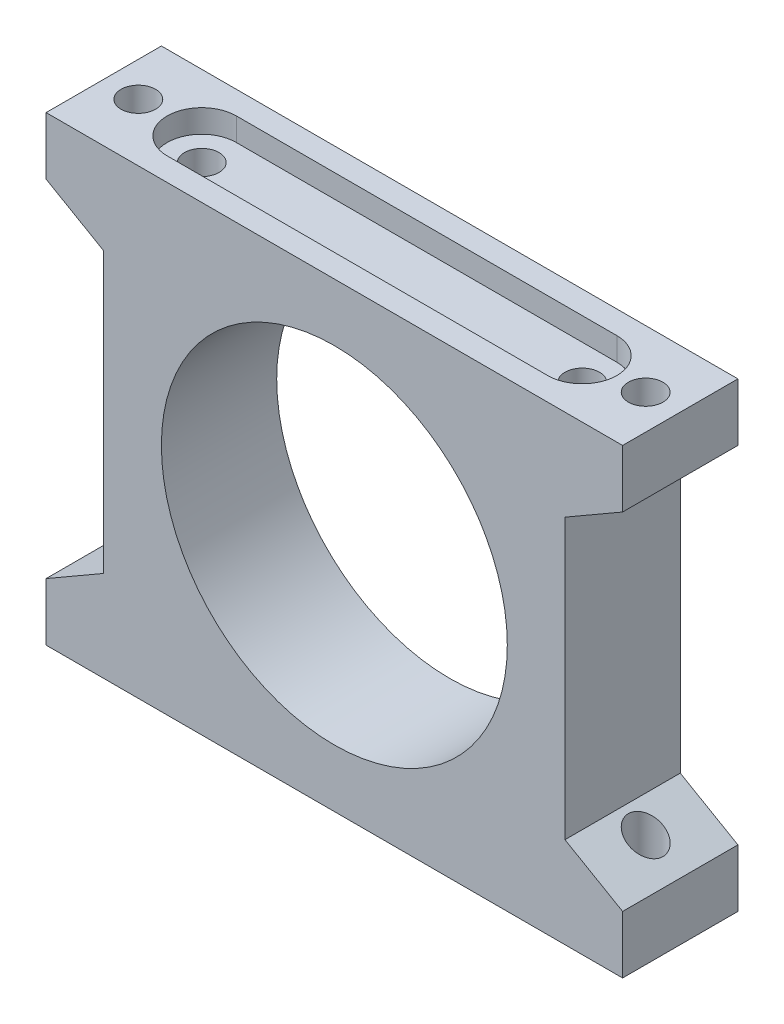
ISO-10303-21;
HEADER;
FILE_DESCRIPTION(('STEP AP214'),'2;1');
FILE_NAME('part.step','',(''),(''),'','','');
FILE_SCHEMA(('AUTOMOTIVE_DESIGN { 1 0 10303 214 1 1 1 1 }'));
ENDSEC;
DATA;
#1=APPLICATION_CONTEXT('core data for automotive mechanical design processes');
#2=APPLICATION_PROTOCOL_DEFINITION('international standard','automotive_design',2000,#1);
#3=PRODUCT_CONTEXT('',#1,'mechanical');
#4=PRODUCT('Part','Part','',(#3));
#5=PRODUCT_RELATED_PRODUCT_CATEGORY('part','',(#4));
#6=PRODUCT_DEFINITION_FORMATION('','',#4);
#7=PRODUCT_DEFINITION_CONTEXT('part definition',#1,'design');
#8=PRODUCT_DEFINITION('design','',#6,#7);
#9=PRODUCT_DEFINITION_SHAPE('','',#8);
#10=(LENGTH_UNIT() NAMED_UNIT(*) SI_UNIT(.MILLI.,.METRE.));
#11=(NAMED_UNIT(*) PLANE_ANGLE_UNIT() SI_UNIT($,.RADIAN.));
#12=(NAMED_UNIT(*) SI_UNIT($,.STERADIAN.) SOLID_ANGLE_UNIT());
#13=UNCERTAINTY_MEASURE_WITH_UNIT(LENGTH_MEASURE(1.E-05),#10,'distance_accuracy_value','');
#14=(GEOMETRIC_REPRESENTATION_CONTEXT(3) GLOBAL_UNCERTAINTY_ASSIGNED_CONTEXT((#13)) GLOBAL_UNIT_ASSIGNED_CONTEXT((#10,
#11,#12)) REPRESENTATION_CONTEXT('',''));
#15=CARTESIAN_POINT('',(0.,0.,0.));
#16=DIRECTION('',(0.,0.,1.));
#17=DIRECTION('',(1.,0.,0.));
#18=AXIS2_PLACEMENT_3D('',#15,#16,#17);
#19=CARTESIAN_POINT('',(-25.,-20.,10.));
#20=DIRECTION('',(0.,1.,0.));
#21=DIRECTION('',(0.,0.,1.));
#22=AXIS2_PLACEMENT_3D('',#19,#20,#21);
#23=PLANE('',#22);
#24=DIRECTION('',(1.,0.,0.));
#25=VECTOR('',#24,1.);
#26=CARTESIAN_POINT('',(-25.,-20.,0.));
#27=LINE('',#26,#25);
#28=CARTESIAN_POINT('',(-25.,-20.,0.));
#29=VERTEX_POINT('',#28);
#30=CARTESIAN_POINT('',(25.,-20.,0.));
#31=VERTEX_POINT('',#30);
#32=EDGE_CURVE('E325',#29,#31,#27,.T.);
#33=ORIENTED_EDGE('',*,*,#32,.T.);
#34=DIRECTION('',(0.,0.,-1.));
#35=VECTOR('',#34,1.);
#36=CARTESIAN_POINT('',(25.,-20.,10.));
#37=LINE('',#36,#35);
#38=CARTESIAN_POINT('',(25.,-20.,10.));
#39=VERTEX_POINT('',#38);
#40=EDGE_CURVE('E355',#39,#31,#37,.T.);
#41=ORIENTED_EDGE('',*,*,#40,.F.);
#42=DIRECTION('',(1.,0.,0.));
#43=VECTOR('',#42,1.);
#44=CARTESIAN_POINT('',(-25.,-20.,10.));
#45=LINE('',#44,#43);
#46=CARTESIAN_POINT('',(-25.,-20.,10.));
#47=VERTEX_POINT('',#46);
#48=EDGE_CURVE('E300',#47,#39,#45,.T.);
#49=ORIENTED_EDGE('',*,*,#48,.F.);
#50=DIRECTION('',(0.,0.,-1.));
#51=VECTOR('',#50,1.);
#52=CARTESIAN_POINT('',(-25.,-20.,10.));
#53=LINE('',#52,#51);
#54=EDGE_CURVE('E358',#47,#29,#53,.T.);
#55=ORIENTED_EDGE('',*,*,#54,.T.);
#56=EDGE_LOOP('',(#33,#41,#49,#55));
#57=FACE_BOUND('',#56,.T.);
#58=CARTESIAN_POINT('',(22.,-20.,4.99999999999999));
#59=DIRECTION('',(0.,1.,0.));
#60=DIRECTION('',(0.,0.,1.));
#61=AXIS2_PLACEMENT_3D('',#58,#59,#60);
#62=CIRCLE('',#61,1.5);
#63=CARTESIAN_POINT('',(22.,-20.,6.5));
#64=VERTEX_POINT('',#63);
#65=EDGE_CURVE('E257',#64,#64,#62,.T.);
#66=ORIENTED_EDGE('',*,*,#65,.T.);
#67=EDGE_LOOP('',(#66));
#68=FACE_BOUND('',#67,.T.);
#69=CARTESIAN_POINT('',(-22.,-20.,5.));
#70=DIRECTION('',(0.,1.,0.));
#71=DIRECTION('',(0.,0.,1.));
#72=AXIS2_PLACEMENT_3D('',#69,#70,#71);
#73=CIRCLE('',#72,1.5);
#74=CARTESIAN_POINT('',(-22.,-20.,6.5));
#75=VERTEX_POINT('',#74);
#76=EDGE_CURVE('E263',#75,#75,#73,.T.);
#77=ORIENTED_EDGE('',*,*,#76,.T.);
#78=EDGE_LOOP('',(#77));
#79=FACE_BOUND('',#78,.T.);
#80=CARTESIAN_POINT('',(-16.5,-20.,5.));
#81=DIRECTION('',(0.,1.,0.));
#82=DIRECTION('',(-1.,0.,0.));
#83=AXIS2_PLACEMENT_3D('',#80,#81,#82);
#84=CIRCLE('',#83,3.);
#85=CARTESIAN_POINT('',(-16.5,-20.,2.));
#86=VERTEX_POINT('',#85);
#87=CARTESIAN_POINT('',(-16.5,-20.,8.));
#88=VERTEX_POINT('',#87);
#89=EDGE_CURVE('E56',#86,#88,#84,.T.);
#90=ORIENTED_EDGE('',*,*,#89,.T.);
#91=DIRECTION('',(1.,0.,0.));
#92=VECTOR('',#91,1.);
#93=CARTESIAN_POINT('',(-16.5,-20.,8.));
#94=LINE('',#93,#92);
#95=CARTESIAN_POINT('',(16.5,-20.,8.));
#96=VERTEX_POINT('',#95);
#97=EDGE_CURVE('E198',#88,#96,#94,.T.);
#98=ORIENTED_EDGE('',*,*,#97,.T.);
#99=CARTESIAN_POINT('',(16.5,-20.,5.));
#100=DIRECTION('',(0.,1.,0.));
#101=DIRECTION('',(-1.,0.,0.));
#102=AXIS2_PLACEMENT_3D('',#99,#100,#101);
#103=CIRCLE('',#102,3.);
#104=CARTESIAN_POINT('',(16.5,-20.,1.99999999999999));
#105=VERTEX_POINT('',#104);
#106=EDGE_CURVE('E201',#96,#105,#103,.T.);
#107=ORIENTED_EDGE('',*,*,#106,.T.);
#108=DIRECTION('',(-1.,0.,0.));
#109=VECTOR('',#108,1.);
#110=CARTESIAN_POINT('',(-16.5,-20.,2.));
#111=LINE('',#110,#109);
#112=EDGE_CURVE('E210',#105,#86,#111,.T.);
#113=ORIENTED_EDGE('',*,*,#112,.T.);
#114=EDGE_LOOP('',(#90,#98,#107,#113));
#115=FACE_BOUND('',#114,.T.);
#116=ADVANCED_FACE('F39',(#57,#68,#79,#115),#23,.F.);
#117=CARTESIAN_POINT('',(0.,0.,10.));
#118=DIRECTION('',(0.,0.,-1.));
#119=DIRECTION('',(-1.,0.,0.));
#120=AXIS2_PLACEMENT_3D('',#117,#118,#119);
#121=PLANE('',#120);
#122=DIRECTION('',(0.,-1.,0.));
#123=VECTOR('',#122,1.);
#124=CARTESIAN_POINT('',(-25.,15.,10.));
#125=LINE('',#124,#123);
#126=CARTESIAN_POINT('',(-25.,20.,10.));
#127=VERTEX_POINT('',#126);
#128=CARTESIAN_POINT('',(-25.,15.,10.));
#129=VERTEX_POINT('',#128);
#130=EDGE_CURVE('E288',#127,#129,#125,.T.);
#131=ORIENTED_EDGE('',*,*,#130,.T.);
#132=DIRECTION('',(0.86602540378444,-0.499999999999998,0.));
#133=VECTOR('',#132,1.);
#134=CARTESIAN_POINT('',(-25.,15.,10.));
#135=LINE('',#134,#133);
#136=CARTESIAN_POINT('',(-20.,12.1132486540519,10.));
#137=VERTEX_POINT('',#136);
#138=EDGE_CURVE('E291',#129,#137,#135,.T.);
#139=ORIENTED_EDGE('',*,*,#138,.T.);
#140=DIRECTION('',(0.,-1.,0.));
#141=VECTOR('',#140,1.);
#142=CARTESIAN_POINT('',(-20.,12.1132486540519,10.));
#143=LINE('',#142,#141);
#144=CARTESIAN_POINT('',(-20.,-12.1132486540519,10.));
#145=VERTEX_POINT('',#144);
#146=EDGE_CURVE('E294',#137,#145,#143,.T.);
#147=ORIENTED_EDGE('',*,*,#146,.T.);
#148=DIRECTION('',(-0.86602540378444,-0.499999999999998,0.));
#149=VECTOR('',#148,1.);
#150=CARTESIAN_POINT('',(-20.,-12.1132486540519,10.));
#151=LINE('',#150,#149);
#152=CARTESIAN_POINT('',(-25.,-15.,10.));
#153=VERTEX_POINT('',#152);
#154=EDGE_CURVE('E296',#145,#153,#151,.T.);
#155=ORIENTED_EDGE('',*,*,#154,.T.);
#156=DIRECTION('',(0.,-1.,0.));
#157=VECTOR('',#156,1.);
#158=CARTESIAN_POINT('',(-25.,-20.,10.));
#159=LINE('',#158,#157);
#160=EDGE_CURVE('E298',#153,#47,#159,.T.);
#161=ORIENTED_EDGE('',*,*,#160,.T.);
#162=ORIENTED_EDGE('',*,*,#48,.T.);
#163=DIRECTION('',(0.,1.,0.));
#164=VECTOR('',#163,1.);
#165=CARTESIAN_POINT('',(25.,-15.,10.));
#166=LINE('',#165,#164);
#167=CARTESIAN_POINT('',(25.,-15.,10.));
#168=VERTEX_POINT('',#167);
#169=EDGE_CURVE('E302',#39,#168,#166,.T.);
#170=ORIENTED_EDGE('',*,*,#169,.T.);
#171=DIRECTION('',(-0.86602540378444,0.499999999999998,0.));
#172=VECTOR('',#171,1.);
#173=CARTESIAN_POINT('',(20.,-12.1132486540519,10.));
#174=LINE('',#173,#172);
#175=CARTESIAN_POINT('',(20.,-12.1132486540519,10.));
#176=VERTEX_POINT('',#175);
#177=EDGE_CURVE('E304',#168,#176,#174,.T.);
#178=ORIENTED_EDGE('',*,*,#177,.T.);
#179=DIRECTION('',(0.,1.,0.));
#180=VECTOR('',#179,1.);
#181=CARTESIAN_POINT('',(20.,12.1132486540519,10.));
#182=LINE('',#181,#180);
#183=CARTESIAN_POINT('',(20.,12.1132486540519,10.));
#184=VERTEX_POINT('',#183);
#185=EDGE_CURVE('E306',#176,#184,#182,.T.);
#186=ORIENTED_EDGE('',*,*,#185,.T.);
#187=DIRECTION('',(0.86602540378444,0.499999999999998,0.));
#188=VECTOR('',#187,1.);
#189=CARTESIAN_POINT('',(25.,15.,10.));
#190=LINE('',#189,#188);
#191=CARTESIAN_POINT('',(25.,15.,10.));
#192=VERTEX_POINT('',#191);
#193=EDGE_CURVE('E308',#184,#192,#190,.T.);
#194=ORIENTED_EDGE('',*,*,#193,.T.);
#195=DIRECTION('',(0.,1.,0.));
#196=VECTOR('',#195,1.);
#197=CARTESIAN_POINT('',(25.,20.,10.));
#198=LINE('',#197,#196);
#199=CARTESIAN_POINT('',(25.,20.,10.));
#200=VERTEX_POINT('',#199);
#201=EDGE_CURVE('E310',#192,#200,#198,.T.);
#202=ORIENTED_EDGE('',*,*,#201,.T.);
#203=DIRECTION('',(-1.,0.,0.));
#204=VECTOR('',#203,1.);
#205=CARTESIAN_POINT('',(-25.,20.,10.));
#206=LINE('',#205,#204);
#207=EDGE_CURVE('E312',#200,#127,#206,.T.);
#208=ORIENTED_EDGE('',*,*,#207,.T.);
#209=EDGE_LOOP('',(#131,#139,#147,#155,#161,#162,#170,#178,#186,#194,#202,#208));
#210=FACE_BOUND('',#209,.T.);
#211=CARTESIAN_POINT('',(0.,0.,10.));
#212=DIRECTION('',(0.,0.,1.));
#213=DIRECTION('',(1.,0.,0.));
#214=AXIS2_PLACEMENT_3D('',#211,#212,#213);
#215=CIRCLE('',#214,15.);
#216=CARTESIAN_POINT('',(15.,0.,10.));
#217=VERTEX_POINT('',#216);
#218=EDGE_CURVE('E282',#217,#217,#215,.T.);
#219=ORIENTED_EDGE('',*,*,#218,.F.);
#220=EDGE_LOOP('',(#219));
#221=FACE_BOUND('',#220,.T.);
#222=ADVANCED_FACE('F409',(#210,#221),#121,.F.);
#223=CARTESIAN_POINT('',(0.,0.,0.));
#224=DIRECTION('',(0.,0.,-1.));
#225=DIRECTION('',(-1.,0.,0.));
#226=AXIS2_PLACEMENT_3D('',#223,#224,#225);
#227=PLANE('',#226);
#228=DIRECTION('',(0.,-1.,0.));
#229=VECTOR('',#228,1.);
#230=CARTESIAN_POINT('',(-25.,15.,0.));
#231=LINE('',#230,#229);
#232=CARTESIAN_POINT('',(-25.,20.,0.));
#233=VERTEX_POINT('',#232);
#234=CARTESIAN_POINT('',(-25.,15.,0.));
#235=VERTEX_POINT('',#234);
#236=EDGE_CURVE('E285',#233,#235,#231,.T.);
#237=ORIENTED_EDGE('',*,*,#236,.F.);
#238=DIRECTION('',(-1.,0.,0.));
#239=VECTOR('',#238,1.);
#240=CARTESIAN_POINT('',(-25.,20.,0.));
#241=LINE('',#240,#239);
#242=CARTESIAN_POINT('',(25.,20.,0.));
#243=VERTEX_POINT('',#242);
#244=EDGE_CURVE('E292',#243,#233,#241,.T.);
#245=ORIENTED_EDGE('',*,*,#244,.F.);
#246=DIRECTION('',(0.,1.,0.));
#247=VECTOR('',#246,1.);
#248=CARTESIAN_POINT('',(25.,20.,0.));
#249=LINE('',#248,#247);
#250=CARTESIAN_POINT('',(25.,15.,0.));
#251=VERTEX_POINT('',#250);
#252=EDGE_CURVE('E335',#251,#243,#249,.T.);
#253=ORIENTED_EDGE('',*,*,#252,.F.);
#254=DIRECTION('',(0.86602540378444,0.499999999999998,0.));
#255=VECTOR('',#254,1.);
#256=CARTESIAN_POINT('',(25.,15.,0.));
#257=LINE('',#256,#255);
#258=CARTESIAN_POINT('',(20.,12.1132486540519,0.));
#259=VERTEX_POINT('',#258);
#260=EDGE_CURVE('E333',#259,#251,#257,.T.);
#261=ORIENTED_EDGE('',*,*,#260,.F.);
#262=DIRECTION('',(0.,1.,0.));
#263=VECTOR('',#262,1.);
#264=CARTESIAN_POINT('',(20.,12.1132486540519,0.));
#265=LINE('',#264,#263);
#266=CARTESIAN_POINT('',(20.,-12.1132486540519,0.));
#267=VERTEX_POINT('',#266);
#268=EDGE_CURVE('E331',#267,#259,#265,.T.);
#269=ORIENTED_EDGE('',*,*,#268,.F.);
#270=DIRECTION('',(-0.86602540378444,0.499999999999998,0.));
#271=VECTOR('',#270,1.);
#272=CARTESIAN_POINT('',(20.,-12.1132486540519,0.));
#273=LINE('',#272,#271);
#274=CARTESIAN_POINT('',(25.,-15.,0.));
#275=VERTEX_POINT('',#274);
#276=EDGE_CURVE('E329',#275,#267,#273,.T.);
#277=ORIENTED_EDGE('',*,*,#276,.F.);
#278=DIRECTION('',(0.,1.,0.));
#279=VECTOR('',#278,1.);
#280=CARTESIAN_POINT('',(25.,-15.,0.));
#281=LINE('',#280,#279);
#282=EDGE_CURVE('E327',#31,#275,#281,.T.);
#283=ORIENTED_EDGE('',*,*,#282,.F.);
#284=ORIENTED_EDGE('',*,*,#32,.F.);
#285=DIRECTION('',(0.,-1.,0.));
#286=VECTOR('',#285,1.);
#287=CARTESIAN_POINT('',(-25.,-20.,0.));
#288=LINE('',#287,#286);
#289=CARTESIAN_POINT('',(-25.,-15.,0.));
#290=VERTEX_POINT('',#289);
#291=EDGE_CURVE('E323',#290,#29,#288,.T.);
#292=ORIENTED_EDGE('',*,*,#291,.F.);
#293=DIRECTION('',(-0.86602540378444,-0.499999999999998,0.));
#294=VECTOR('',#293,1.);
#295=CARTESIAN_POINT('',(-20.,-12.1132486540519,0.));
#296=LINE('',#295,#294);
#297=CARTESIAN_POINT('',(-20.,-12.1132486540519,0.));
#298=VERTEX_POINT('',#297);
#299=EDGE_CURVE('E321',#298,#290,#296,.T.);
#300=ORIENTED_EDGE('',*,*,#299,.F.);
#301=DIRECTION('',(0.,-1.,0.));
#302=VECTOR('',#301,1.);
#303=CARTESIAN_POINT('',(-20.,12.1132486540519,0.));
#304=LINE('',#303,#302);
#305=CARTESIAN_POINT('',(-20.,12.1132486540519,0.));
#306=VERTEX_POINT('',#305);
#307=EDGE_CURVE('E319',#306,#298,#304,.T.);
#308=ORIENTED_EDGE('',*,*,#307,.F.);
#309=DIRECTION('',(0.86602540378444,-0.499999999999998,0.));
#310=VECTOR('',#309,1.);
#311=CARTESIAN_POINT('',(-25.,15.,0.));
#312=LINE('',#311,#310);
#313=EDGE_CURVE('E317',#235,#306,#312,.T.);
#314=ORIENTED_EDGE('',*,*,#313,.F.);
#315=EDGE_LOOP('',(#237,#245,#253,#261,#269,#277,#283,#284,#292,#300,#308,#314));
#316=FACE_BOUND('',#315,.T.);
#317=CARTESIAN_POINT('',(0.,0.,0.));
#318=DIRECTION('',(0.,0.,1.));
#319=DIRECTION('',(1.,0.,0.));
#320=AXIS2_PLACEMENT_3D('',#317,#318,#319);
#321=CIRCLE('',#320,15.);
#322=CARTESIAN_POINT('',(15.,0.,0.));
#323=VERTEX_POINT('',#322);
#324=EDGE_CURVE('E281',#323,#323,#321,.T.);
#325=ORIENTED_EDGE('',*,*,#324,.T.);
#326=EDGE_LOOP('',(#325));
#327=FACE_BOUND('',#326,.T.);
#328=ADVANCED_FACE('F401',(#316,#327),#227,.T.);
#329=CARTESIAN_POINT('',(-25.,15.,10.));
#330=DIRECTION('',(1.,0.,0.));
#331=DIRECTION('',(0.,1.,0.));
#332=AXIS2_PLACEMENT_3D('',#329,#330,#331);
#333=PLANE('',#332);
#334=ORIENTED_EDGE('',*,*,#236,.T.);
#335=DIRECTION('',(0.,0.,-1.));
#336=VECTOR('',#335,1.);
#337=CARTESIAN_POINT('',(-25.,15.,10.));
#338=LINE('',#337,#336);
#339=EDGE_CURVE('E12',#129,#235,#338,.T.);
#340=ORIENTED_EDGE('',*,*,#339,.F.);
#341=ORIENTED_EDGE('',*,*,#130,.F.);
#342=DIRECTION('',(0.,0.,-1.));
#343=VECTOR('',#342,1.);
#344=CARTESIAN_POINT('',(-25.,20.,10.));
#345=LINE('',#344,#343);
#346=EDGE_CURVE('E314',#127,#233,#345,.T.);
#347=ORIENTED_EDGE('',*,*,#346,.T.);
#348=EDGE_LOOP('',(#334,#340,#341,#347));
#349=FACE_BOUND('',#348,.T.);
#350=ADVANCED_FACE('F41',(#349),#333,.F.);
#351=CARTESIAN_POINT('',(-25.,15.,10.));
#352=DIRECTION('',(0.499999999999997,0.86602540378444,0.));
#353=DIRECTION('',(-0.86602540378444,0.499999999999998,0.));
#354=AXIS2_PLACEMENT_3D('',#351,#352,#353);
#355=PLANE('',#354);
#356=CARTESIAN_POINT('',(-22.,13.2679491924311,5.));
#357=DIRECTION('',(0.499999999999997,0.86602540378444,0.));
#358=DIRECTION('',(-0.86602540378444,0.499999999999998,0.));
#359=AXIS2_PLACEMENT_3D('',#356,#357,#358);
#360=ELLIPSE('',#359,1.73205080756888,1.5);
#361=CARTESIAN_POINT('',(-23.5,14.1339745962155,5.));
#362=VERTEX_POINT('',#361);
#363=EDGE_CURVE('E278',#362,#362,#360,.T.);
#364=ORIENTED_EDGE('',*,*,#363,.T.);
#365=EDGE_LOOP('',(#364));
#366=FACE_BOUND('',#365,.T.);
#367=ORIENTED_EDGE('',*,*,#313,.T.);
#368=DIRECTION('',(0.,0.,-1.));
#369=VECTOR('',#368,1.);
#370=CARTESIAN_POINT('',(-20.,12.1132486540519,10.));
#371=LINE('',#370,#369);
#372=EDGE_CURVE('E48',#137,#306,#371,.T.);
#373=ORIENTED_EDGE('',*,*,#372,.F.);
#374=ORIENTED_EDGE('',*,*,#138,.F.);
#375=ORIENTED_EDGE('',*,*,#339,.T.);
#376=EDGE_LOOP('',(#367,#373,#374,#375));
#377=FACE_BOUND('',#376,.T.);
#378=ADVANCED_FACE('F445',(#366,#377),#355,.F.);
#379=CARTESIAN_POINT('',(-20.,12.1132486540519,10.));
#380=DIRECTION('',(1.,0.,0.));
#381=DIRECTION('',(0.,1.,0.));
#382=AXIS2_PLACEMENT_3D('',#379,#380,#381);
#383=PLANE('',#382);
#384=ORIENTED_EDGE('',*,*,#307,.T.);
#385=DIRECTION('',(0.,0.,-1.));
#386=VECTOR('',#385,1.);
#387=CARTESIAN_POINT('',(-20.,-12.1132486540519,10.));
#388=LINE('',#387,#386);
#389=EDGE_CURVE('E364',#145,#298,#388,.T.);
#390=ORIENTED_EDGE('',*,*,#389,.F.);
#391=ORIENTED_EDGE('',*,*,#146,.F.);
#392=ORIENTED_EDGE('',*,*,#372,.T.);
#393=EDGE_LOOP('',(#384,#390,#391,#392));
#394=FACE_BOUND('',#393,.T.);
#395=ADVANCED_FACE('F443',(#394),#383,.F.);
#396=CARTESIAN_POINT('',(-20.,-12.1132486540519,10.));
#397=DIRECTION('',(0.499999999999998,-0.86602540378444,0.));
#398=DIRECTION('',(0.86602540378444,0.499999999999998,0.));
#399=AXIS2_PLACEMENT_3D('',#396,#397,#398);
#400=PLANE('',#399);
#401=CARTESIAN_POINT('',(-22.,-13.2679491924311,5.));
#402=DIRECTION('',(0.499999999999998,-0.86602540378444,0.));
#403=DIRECTION('',(0.86602540378444,0.499999999999998,0.));
#404=AXIS2_PLACEMENT_3D('',#401,#402,#403);
#405=ELLIPSE('',#404,1.73205080756888,1.5);
#406=CARTESIAN_POINT('',(-20.5,-12.4019237886467,5.));
#407=VERTEX_POINT('',#406);
#408=EDGE_CURVE('E275',#407,#407,#405,.T.);
#409=ORIENTED_EDGE('',*,*,#408,.T.);
#410=EDGE_LOOP('',(#409));
#411=FACE_BOUND('',#410,.T.);
#412=ORIENTED_EDGE('',*,*,#299,.T.);
#413=DIRECTION('',(0.,0.,-1.));
#414=VECTOR('',#413,1.);
#415=CARTESIAN_POINT('',(-25.,-15.,10.));
#416=LINE('',#415,#414);
#417=EDGE_CURVE('E361',#153,#290,#416,.T.);
#418=ORIENTED_EDGE('',*,*,#417,.F.);
#419=ORIENTED_EDGE('',*,*,#154,.F.);
#420=ORIENTED_EDGE('',*,*,#389,.T.);
#421=EDGE_LOOP('',(#412,#418,#419,#420));
#422=FACE_BOUND('',#421,.T.);
#423=ADVANCED_FACE('F439',(#411,#422),#400,.F.);
#424=CARTESIAN_POINT('',(-25.,-20.,10.));
#425=DIRECTION('',(1.,0.,0.));
#426=DIRECTION('',(0.,1.,0.));
#427=AXIS2_PLACEMENT_3D('',#424,#425,#426);
#428=PLANE('',#427);
#429=ORIENTED_EDGE('',*,*,#291,.T.);
#430=ORIENTED_EDGE('',*,*,#54,.F.);
#431=ORIENTED_EDGE('',*,*,#160,.F.);
#432=ORIENTED_EDGE('',*,*,#417,.T.);
#433=EDGE_LOOP('',(#429,#430,#431,#432));
#434=FACE_BOUND('',#433,.T.);
#435=ADVANCED_FACE('F434',(#434),#428,.F.);
#436=CARTESIAN_POINT('',(25.,-15.,10.));
#437=DIRECTION('',(-1.,0.,0.));
#438=DIRECTION('',(0.,-1.,0.));
#439=AXIS2_PLACEMENT_3D('',#436,#437,#438);
#440=PLANE('',#439);
#441=ORIENTED_EDGE('',*,*,#282,.T.);
#442=DIRECTION('',(0.,0.,-1.));
#443=VECTOR('',#442,1.);
#444=CARTESIAN_POINT('',(25.,-15.,10.));
#445=LINE('',#444,#443);
#446=EDGE_CURVE('E352',#168,#275,#445,.T.);
#447=ORIENTED_EDGE('',*,*,#446,.F.);
#448=ORIENTED_EDGE('',*,*,#169,.F.);
#449=ORIENTED_EDGE('',*,*,#40,.T.);
#450=EDGE_LOOP('',(#441,#447,#448,#449));
#451=FACE_BOUND('',#450,.T.);
#452=ADVANCED_FACE('F424',(#451),#440,.F.);
#453=CARTESIAN_POINT('',(20.,-12.1132486540519,10.));
#454=DIRECTION('',(-0.499999999999998,-0.86602540378444,0.));
#455=DIRECTION('',(0.86602540378444,-0.499999999999998,0.));
#456=AXIS2_PLACEMENT_3D('',#453,#454,#455);
#457=PLANE('',#456);
#458=CARTESIAN_POINT('',(22.,-13.2679491924311,4.99999999999999));
#459=DIRECTION('',(-0.499999999999998,-0.86602540378444,0.));
#460=DIRECTION('',(-0.86602540378444,0.499999999999998,0.));
#461=AXIS2_PLACEMENT_3D('',#458,#459,#460);
#462=ELLIPSE('',#461,1.73205080756888,1.5);
#463=CARTESIAN_POINT('',(20.5,-12.4019237886467,4.99999999999999));
#464=VERTEX_POINT('',#463);
#465=EDGE_CURVE('E272',#464,#464,#462,.T.);
#466=ORIENTED_EDGE('',*,*,#465,.T.);
#467=EDGE_LOOP('',(#466));
#468=FACE_BOUND('',#467,.T.);
#469=ORIENTED_EDGE('',*,*,#276,.T.);
#470=DIRECTION('',(0.,0.,-1.));
#471=VECTOR('',#470,1.);
#472=CARTESIAN_POINT('',(20.,-12.1132486540519,10.));
#473=LINE('',#472,#471);
#474=EDGE_CURVE('E349',#176,#267,#473,.T.);
#475=ORIENTED_EDGE('',*,*,#474,.F.);
#476=ORIENTED_EDGE('',*,*,#177,.F.);
#477=ORIENTED_EDGE('',*,*,#446,.T.);
#478=EDGE_LOOP('',(#469,#475,#476,#477));
#479=FACE_BOUND('',#478,.T.);
#480=ADVANCED_FACE('F420',(#468,#479),#457,.F.);
#481=CARTESIAN_POINT('',(20.,12.1132486540519,10.));
#482=DIRECTION('',(-1.,0.,0.));
#483=DIRECTION('',(0.,-1.,0.));
#484=AXIS2_PLACEMENT_3D('',#481,#482,#483);
#485=PLANE('',#484);
#486=ORIENTED_EDGE('',*,*,#268,.T.);
#487=DIRECTION('',(0.,0.,-1.));
#488=VECTOR('',#487,1.);
#489=CARTESIAN_POINT('',(20.,12.1132486540519,10.));
#490=LINE('',#489,#488);
#491=EDGE_CURVE('E346',#184,#259,#490,.T.);
#492=ORIENTED_EDGE('',*,*,#491,.F.);
#493=ORIENTED_EDGE('',*,*,#185,.F.);
#494=ORIENTED_EDGE('',*,*,#474,.T.);
#495=EDGE_LOOP('',(#486,#492,#493,#494));
#496=FACE_BOUND('',#495,.T.);
#497=ADVANCED_FACE('F387',(#496),#485,.F.);
#498=CARTESIAN_POINT('',(25.,15.,10.));
#499=DIRECTION('',(-0.499999999999997,0.86602540378444,0.));
#500=DIRECTION('',(-0.86602540378444,-0.499999999999998,0.));
#501=AXIS2_PLACEMENT_3D('',#498,#499,#500);
#502=PLANE('',#501);
#503=CARTESIAN_POINT('',(22.,13.2679491924311,4.99999999999999));
#504=DIRECTION('',(-0.499999999999997,0.86602540378444,0.));
#505=DIRECTION('',(0.86602540378444,0.499999999999998,0.));
#506=AXIS2_PLACEMENT_3D('',#503,#504,#505);
#507=ELLIPSE('',#506,1.73205080756888,1.5);
#508=CARTESIAN_POINT('',(23.5,14.1339745962155,4.99999999999999));
#509=VERTEX_POINT('',#508);
#510=EDGE_CURVE('E269',#509,#509,#507,.T.);
#511=ORIENTED_EDGE('',*,*,#510,.T.);
#512=EDGE_LOOP('',(#511));
#513=FACE_BOUND('',#512,.T.);
#514=ORIENTED_EDGE('',*,*,#260,.T.);
#515=DIRECTION('',(0.,0.,-1.));
#516=VECTOR('',#515,1.);
#517=CARTESIAN_POINT('',(25.,15.,10.));
#518=LINE('',#517,#516);
#519=EDGE_CURVE('E343',#192,#251,#518,.T.);
#520=ORIENTED_EDGE('',*,*,#519,.F.);
#521=ORIENTED_EDGE('',*,*,#193,.F.);
#522=ORIENTED_EDGE('',*,*,#491,.T.);
#523=EDGE_LOOP('',(#514,#520,#521,#522));
#524=FACE_BOUND('',#523,.T.);
#525=ADVANCED_FACE('F383',(#513,#524),#502,.F.);
#526=CARTESIAN_POINT('',(25.,20.,10.));
#527=DIRECTION('',(-1.,0.,0.));
#528=DIRECTION('',(0.,-1.,0.));
#529=AXIS2_PLACEMENT_3D('',#526,#527,#528);
#530=PLANE('',#529);
#531=ORIENTED_EDGE('',*,*,#252,.T.);
#532=DIRECTION('',(0.,0.,-1.));
#533=VECTOR('',#532,1.);
#534=CARTESIAN_POINT('',(25.,20.,10.));
#535=LINE('',#534,#533);
#536=EDGE_CURVE('E340',#200,#243,#535,.T.);
#537=ORIENTED_EDGE('',*,*,#536,.F.);
#538=ORIENTED_EDGE('',*,*,#201,.F.);
#539=ORIENTED_EDGE('',*,*,#519,.T.);
#540=EDGE_LOOP('',(#531,#537,#538,#539));
#541=FACE_BOUND('',#540,.T.);
#542=ADVANCED_FACE('F386',(#541),#530,.F.);
#543=CARTESIAN_POINT('',(-25.,20.,10.));
#544=DIRECTION('',(0.,-1.,0.));
#545=DIRECTION('',(1.,0.,0.));
#546=AXIS2_PLACEMENT_3D('',#543,#544,#545);
#547=PLANE('',#546);
#548=DIRECTION('',(1.,0.,0.));
#549=VECTOR('',#548,1.);
#550=CARTESIAN_POINT('',(-16.5,20.,8.));
#551=LINE('',#550,#549);
#552=CARTESIAN_POINT('',(-16.5,20.,8.));
#553=VERTEX_POINT('',#552);
#554=CARTESIAN_POINT('',(16.5,20.,8.));
#555=VERTEX_POINT('',#554);
#556=EDGE_CURVE('E247',#553,#555,#551,.T.);
#557=ORIENTED_EDGE('',*,*,#556,.F.);
#558=CARTESIAN_POINT('',(-16.5,20.,5.));
#559=DIRECTION('',(0.,1.,0.));
#560=DIRECTION('',(-1.,0.,0.));
#561=AXIS2_PLACEMENT_3D('',#558,#559,#560);
#562=CIRCLE('',#561,3.);
#563=CARTESIAN_POINT('',(-16.5,20.,2.));
#564=VERTEX_POINT('',#563);
#565=EDGE_CURVE('E64',#564,#553,#562,.T.);
#566=ORIENTED_EDGE('',*,*,#565,.F.);
#567=DIRECTION('',(-1.,0.,0.));
#568=VECTOR('',#567,1.);
#569=CARTESIAN_POINT('',(-16.5,20.,2.));
#570=LINE('',#569,#568);
#571=CARTESIAN_POINT('',(16.5,20.,1.99999999999999));
#572=VERTEX_POINT('',#571);
#573=EDGE_CURVE('E236',#572,#564,#570,.T.);
#574=ORIENTED_EDGE('',*,*,#573,.F.);
#575=CARTESIAN_POINT('',(16.5,20.,5.));
#576=DIRECTION('',(0.,1.,0.));
#577=DIRECTION('',(-1.,0.,0.));
#578=AXIS2_PLACEMENT_3D('',#575,#576,#577);
#579=CIRCLE('',#578,3.);
#580=EDGE_CURVE('E250',#555,#572,#579,.T.);
#581=ORIENTED_EDGE('',*,*,#580,.F.);
#582=EDGE_LOOP('',(#557,#566,#574,#581));
#583=FACE_BOUND('',#582,.T.);
#584=CARTESIAN_POINT('',(-22.,20.,5.));
#585=DIRECTION('',(0.,-1.,0.));
#586=DIRECTION('',(1.,0.,0.));
#587=AXIS2_PLACEMENT_3D('',#584,#585,#586);
#588=CIRCLE('',#587,1.5);
#589=CARTESIAN_POINT('',(-20.5,20.,5.));
#590=VERTEX_POINT('',#589);
#591=EDGE_CURVE('E43',#590,#590,#588,.T.);
#592=ORIENTED_EDGE('',*,*,#591,.T.);
#593=EDGE_LOOP('',(#592));
#594=FACE_BOUND('',#593,.T.);
#595=CARTESIAN_POINT('',(22.,20.,4.99999999999999));
#596=DIRECTION('',(0.,-1.,0.));
#597=DIRECTION('',(1.,0.,0.));
#598=AXIS2_PLACEMENT_3D('',#595,#596,#597);
#599=CIRCLE('',#598,1.5);
#600=CARTESIAN_POINT('',(23.5,20.,4.99999999999999));
#601=VERTEX_POINT('',#600);
#602=EDGE_CURVE('E266',#601,#601,#599,.T.);
#603=ORIENTED_EDGE('',*,*,#602,.T.);
#604=EDGE_LOOP('',(#603));
#605=FACE_BOUND('',#604,.T.);
#606=ORIENTED_EDGE('',*,*,#244,.T.);
#607=ORIENTED_EDGE('',*,*,#346,.F.);
#608=ORIENTED_EDGE('',*,*,#207,.F.);
#609=ORIENTED_EDGE('',*,*,#536,.T.);
#610=EDGE_LOOP('',(#606,#607,#608,#609));
#611=FACE_BOUND('',#610,.T.);
#612=ADVANCED_FACE('F371',(#583,#594,#605,#611),#547,.F.);
#613=CARTESIAN_POINT('',(0.,0.,10.));
#614=DIRECTION('',(0.,0.,-1.));
#615=DIRECTION('',(-1.,0.,0.));
#616=AXIS2_PLACEMENT_3D('',#613,#614,#615);
#617=CYLINDRICAL_SURFACE('',#616,15.);
#618=ORIENTED_EDGE('',*,*,#218,.T.);
#619=EDGE_LOOP('',(#618));
#620=FACE_BOUND('',#619,.T.);
#621=ORIENTED_EDGE('',*,*,#324,.F.);
#622=EDGE_LOOP('',(#621));
#623=FACE_BOUND('',#622,.T.);
#624=ADVANCED_FACE('F378',(#620,#623),#617,.F.);
#625=CARTESIAN_POINT('',(22.,-20.,4.99999999999999));
#626=DIRECTION('',(0.,1.,0.));
#627=DIRECTION('',(0.,0.,1.));
#628=AXIS2_PLACEMENT_3D('',#625,#626,#627);
#629=CYLINDRICAL_SURFACE('',#628,1.5);
#630=ORIENTED_EDGE('',*,*,#602,.F.);
#631=EDGE_LOOP('',(#630));
#632=FACE_BOUND('',#631,.T.);
#633=ORIENTED_EDGE('',*,*,#510,.F.);
#634=EDGE_LOOP('',(#633));
#635=FACE_BOUND('',#634,.T.);
#636=ADVANCED_FACE('F374',(#632,#635),#629,.F.);
#637=CARTESIAN_POINT('',(-22.,-20.,5.));
#638=DIRECTION('',(0.,1.,0.));
#639=DIRECTION('',(0.,0.,1.));
#640=AXIS2_PLACEMENT_3D('',#637,#638,#639);
#641=CYLINDRICAL_SURFACE('',#640,1.5);
#642=ORIENTED_EDGE('',*,*,#591,.F.);
#643=EDGE_LOOP('',(#642));
#644=FACE_BOUND('',#643,.T.);
#645=ORIENTED_EDGE('',*,*,#363,.F.);
#646=EDGE_LOOP('',(#645));
#647=FACE_BOUND('',#646,.T.);
#648=ADVANCED_FACE('F377',(#644,#647),#641,.F.);
#649=ORIENTED_EDGE('',*,*,#65,.F.);
#650=EDGE_LOOP('',(#649));
#651=FACE_BOUND('',#650,.T.);
#652=ORIENTED_EDGE('',*,*,#465,.F.);
#653=EDGE_LOOP('',(#652));
#654=FACE_BOUND('',#653,.T.);
#655=ADVANCED_FACE('F380',(#651,#654),#629,.F.);
#656=ORIENTED_EDGE('',*,*,#76,.F.);
#657=EDGE_LOOP('',(#656));
#658=FACE_BOUND('',#657,.T.);
#659=ORIENTED_EDGE('',*,*,#408,.F.);
#660=EDGE_LOOP('',(#659));
#661=FACE_BOUND('',#660,.T.);
#662=ADVANCED_FACE('F472',(#658,#661),#641,.F.);
#663=CARTESIAN_POINT('',(-16.5,18.,5.));
#664=DIRECTION('',(0.,1.,0.));
#665=DIRECTION('',(-1.,0.,0.));
#666=AXIS2_PLACEMENT_3D('',#663,#664,#665);
#667=CYLINDRICAL_SURFACE('',#666,3.);
#668=ORIENTED_EDGE('',*,*,#565,.T.);
#669=DIRECTION('',(0.,1.,0.));
#670=VECTOR('',#669,1.);
#671=CARTESIAN_POINT('',(-16.5,18.,8.));
#672=LINE('',#671,#670);
#673=CARTESIAN_POINT('',(-16.5,18.,8.));
#674=VERTEX_POINT('',#673);
#675=EDGE_CURVE('E245',#674,#553,#672,.T.);
#676=ORIENTED_EDGE('',*,*,#675,.F.);
#677=CARTESIAN_POINT('',(-16.5,18.,5.));
#678=DIRECTION('',(0.,1.,0.));
#679=DIRECTION('',(-1.,0.,0.));
#680=AXIS2_PLACEMENT_3D('',#677,#678,#679);
#681=CIRCLE('',#680,3.);
#682=CARTESIAN_POINT('',(-16.5,18.,2.));
#683=VERTEX_POINT('',#682);
#684=EDGE_CURVE('E232',#683,#674,#681,.T.);
#685=ORIENTED_EDGE('',*,*,#684,.F.);
#686=DIRECTION('',(0.,1.,0.));
#687=VECTOR('',#686,1.);
#688=CARTESIAN_POINT('',(-16.5,18.,2.));
#689=LINE('',#688,#687);
#690=EDGE_CURVE('E255',#683,#564,#689,.T.);
#691=ORIENTED_EDGE('',*,*,#690,.T.);
#692=EDGE_LOOP('',(#668,#676,#685,#691));
#693=FACE_BOUND('',#692,.T.);
#694=ADVANCED_FACE('F474',(#693),#667,.F.);
#695=CARTESIAN_POINT('',(-16.5,18.,2.));
#696=DIRECTION('',(0.,0.,-1.));
#697=DIRECTION('',(-1.,0.,0.));
#698=AXIS2_PLACEMENT_3D('',#695,#696,#697);
#699=PLANE('',#698);
#700=ORIENTED_EDGE('',*,*,#573,.T.);
#701=ORIENTED_EDGE('',*,*,#690,.F.);
#702=DIRECTION('',(-1.,0.,0.));
#703=VECTOR('',#702,1.);
#704=CARTESIAN_POINT('',(-16.5,18.,2.));
#705=LINE('',#704,#703);
#706=CARTESIAN_POINT('',(16.5,18.,1.99999999999999));
#707=VERTEX_POINT('',#706);
#708=EDGE_CURVE('E242',#707,#683,#705,.T.);
#709=ORIENTED_EDGE('',*,*,#708,.F.);
#710=DIRECTION('',(0.,1.,0.));
#711=VECTOR('',#710,1.);
#712=CARTESIAN_POINT('',(16.5,18.,1.99999999999999));
#713=LINE('',#712,#711);
#714=EDGE_CURVE('E258',#707,#572,#713,.T.);
#715=ORIENTED_EDGE('',*,*,#714,.T.);
#716=EDGE_LOOP('',(#700,#701,#709,#715));
#717=FACE_BOUND('',#716,.T.);
#718=ADVANCED_FACE('F481',(#717),#699,.F.);
#719=CARTESIAN_POINT('',(16.5,18.,5.));
#720=DIRECTION('',(0.,1.,0.));
#721=DIRECTION('',(-1.,0.,0.));
#722=AXIS2_PLACEMENT_3D('',#719,#720,#721);
#723=CYLINDRICAL_SURFACE('',#722,3.);
#724=ORIENTED_EDGE('',*,*,#580,.T.);
#725=ORIENTED_EDGE('',*,*,#714,.F.);
#726=CARTESIAN_POINT('',(16.5,18.,5.));
#727=DIRECTION('',(0.,1.,0.));
#728=DIRECTION('',(-1.,0.,0.));
#729=AXIS2_PLACEMENT_3D('',#726,#727,#728);
#730=CIRCLE('',#729,3.);
#731=CARTESIAN_POINT('',(16.5,18.,8.));
#732=VERTEX_POINT('',#731);
#733=EDGE_CURVE('E239',#732,#707,#730,.T.);
#734=ORIENTED_EDGE('',*,*,#733,.F.);
#735=DIRECTION('',(0.,1.,0.));
#736=VECTOR('',#735,1.);
#737=CARTESIAN_POINT('',(16.5,18.,8.));
#738=LINE('',#737,#736);
#739=EDGE_CURVE('E260',#732,#555,#738,.T.);
#740=ORIENTED_EDGE('',*,*,#739,.T.);
#741=EDGE_LOOP('',(#724,#725,#734,#740));
#742=FACE_BOUND('',#741,.T.);
#743=ADVANCED_FACE('F615',(#742),#723,.F.);
#744=CARTESIAN_POINT('',(-16.5,18.,8.));
#745=DIRECTION('',(0.,0.,1.));
#746=DIRECTION('',(1.,0.,0.));
#747=AXIS2_PLACEMENT_3D('',#744,#745,#746);
#748=PLANE('',#747);
#749=ORIENTED_EDGE('',*,*,#556,.T.);
#750=ORIENTED_EDGE('',*,*,#739,.F.);
#751=DIRECTION('',(1.,0.,0.));
#752=VECTOR('',#751,1.);
#753=CARTESIAN_POINT('',(-16.5,18.,8.));
#754=LINE('',#753,#752);
#755=EDGE_CURVE('E235',#674,#732,#754,.T.);
#756=ORIENTED_EDGE('',*,*,#755,.F.);
#757=ORIENTED_EDGE('',*,*,#675,.T.);
#758=EDGE_LOOP('',(#749,#750,#756,#757));
#759=FACE_BOUND('',#758,.T.);
#760=ADVANCED_FACE('F626',(#759),#748,.F.);
#761=CARTESIAN_POINT('',(-16.5,18.,5.));
#762=DIRECTION('',(0.,1.,0.));
#763=DIRECTION('',(-1.,0.,0.));
#764=AXIS2_PLACEMENT_3D('',#761,#762,#763);
#765=PLANE('',#764);
#766=CARTESIAN_POINT('',(-16.5,18.,5.));
#767=DIRECTION('',(0.,1.,0.));
#768=DIRECTION('',(-1.,0.,0.));
#769=AXIS2_PLACEMENT_3D('',#766,#767,#768);
#770=CIRCLE('',#769,1.5);
#771=CARTESIAN_POINT('',(-18.,18.,5.));
#772=VERTEX_POINT('',#771);
#773=EDGE_CURVE('E224',#772,#772,#770,.T.);
#774=ORIENTED_EDGE('',*,*,#773,.F.);
#775=EDGE_LOOP('',(#774));
#776=FACE_BOUND('',#775,.T.);
#777=CARTESIAN_POINT('',(16.5,18.,5.00000000000001));
#778=DIRECTION('',(0.,1.,0.));
#779=DIRECTION('',(1.,0.,0.));
#780=AXIS2_PLACEMENT_3D('',#777,#778,#779);
#781=CIRCLE('',#780,1.5);
#782=CARTESIAN_POINT('',(18.,18.,5.00000000000001));
#783=VERTEX_POINT('',#782);
#784=EDGE_CURVE('E227',#783,#783,#781,.T.);
#785=ORIENTED_EDGE('',*,*,#784,.F.);
#786=EDGE_LOOP('',(#785));
#787=FACE_BOUND('',#786,.T.);
#788=ORIENTED_EDGE('',*,*,#684,.T.);
#789=ORIENTED_EDGE('',*,*,#755,.T.);
#790=ORIENTED_EDGE('',*,*,#733,.T.);
#791=ORIENTED_EDGE('',*,*,#708,.T.);
#792=EDGE_LOOP('',(#788,#789,#790,#791));
#793=FACE_BOUND('',#792,.T.);
#794=ADVANCED_FACE('F637',(#776,#787,#793),#765,.T.);
#795=CARTESIAN_POINT('',(16.5,15.,5.00000000000001));
#796=DIRECTION('',(0.,1.,0.));
#797=DIRECTION('',(-1.,0.,0.));
#798=AXIS2_PLACEMENT_3D('',#795,#796,#797);
#799=CYLINDRICAL_SURFACE('',#798,1.5);
#800=CARTESIAN_POINT('',(16.5,15.,5.00000000000001));
#801=DIRECTION('',(0.,1.,0.));
#802=DIRECTION('',(1.,0.,0.));
#803=AXIS2_PLACEMENT_3D('',#800,#801,#802);
#804=CIRCLE('',#803,1.5);
#805=CARTESIAN_POINT('',(18.,15.,5.00000000000001));
#806=VERTEX_POINT('',#805);
#807=EDGE_CURVE('E217',#806,#806,#804,.T.);
#808=ORIENTED_EDGE('',*,*,#807,.F.);
#809=EDGE_LOOP('',(#808));
#810=FACE_BOUND('',#809,.T.);
#811=ORIENTED_EDGE('',*,*,#784,.T.);
#812=EDGE_LOOP('',(#811));
#813=FACE_BOUND('',#812,.T.);
#814=ADVANCED_FACE('F648',(#810,#813),#799,.F.);
#815=CARTESIAN_POINT('',(16.5,15.,5.00000000000001));
#816=DIRECTION('',(0.,-1.,0.));
#817=DIRECTION('',(1.,0.,0.));
#818=AXIS2_PLACEMENT_3D('',#815,#816,#817);
#819=PLANE('',#818);
#820=ORIENTED_EDGE('',*,*,#807,.T.);
#821=EDGE_LOOP('',(#820));
#822=FACE_BOUND('',#821,.T.);
#823=ADVANCED_FACE('F659',(#822),#819,.F.);
#824=CARTESIAN_POINT('',(-16.5,15.,5.));
#825=DIRECTION('',(0.,1.,0.));
#826=DIRECTION('',(-1.,0.,0.));
#827=AXIS2_PLACEMENT_3D('',#824,#825,#826);
#828=CYLINDRICAL_SURFACE('',#827,1.5);
#829=CARTESIAN_POINT('',(-16.5,15.,5.));
#830=DIRECTION('',(0.,1.,0.));
#831=DIRECTION('',(-1.,0.,0.));
#832=AXIS2_PLACEMENT_3D('',#829,#830,#831);
#833=CIRCLE('',#832,1.5);
#834=CARTESIAN_POINT('',(-18.,15.,5.));
#835=VERTEX_POINT('',#834);
#836=EDGE_CURVE('E221',#835,#835,#833,.T.);
#837=ORIENTED_EDGE('',*,*,#836,.F.);
#838=EDGE_LOOP('',(#837));
#839=FACE_BOUND('',#838,.T.);
#840=ORIENTED_EDGE('',*,*,#773,.T.);
#841=EDGE_LOOP('',(#840));
#842=FACE_BOUND('',#841,.T.);
#843=ADVANCED_FACE('F670',(#839,#842),#828,.F.);
#844=CARTESIAN_POINT('',(-16.5,15.,5.));
#845=DIRECTION('',(0.,1.,0.));
#846=DIRECTION('',(-1.,0.,0.));
#847=AXIS2_PLACEMENT_3D('',#844,#845,#846);
#848=PLANE('',#847);
#849=ORIENTED_EDGE('',*,*,#836,.T.);
#850=EDGE_LOOP('',(#849));
#851=FACE_BOUND('',#850,.T.);
#852=ADVANCED_FACE('F681',(#851),#848,.T.);
#853=CARTESIAN_POINT('',(-16.5,-18.,5.));
#854=DIRECTION('',(0.,-1.,0.));
#855=DIRECTION('',(1.,0.,0.));
#856=AXIS2_PLACEMENT_3D('',#853,#854,#855);
#857=CYLINDRICAL_SURFACE('',#856,3.);
#858=ORIENTED_EDGE('',*,*,#89,.F.);
#859=DIRECTION('',(0.,-1.,0.));
#860=VECTOR('',#859,1.);
#861=CARTESIAN_POINT('',(-16.5,-18.,2.));
#862=LINE('',#861,#860);
#863=CARTESIAN_POINT('',(-16.5,-18.,2.));
#864=VERTEX_POINT('',#863);
#865=EDGE_CURVE('E183',#864,#86,#862,.T.);
#866=ORIENTED_EDGE('',*,*,#865,.F.);
#867=CARTESIAN_POINT('',(-16.5,-18.,5.));
#868=DIRECTION('',(0.,1.,0.));
#869=DIRECTION('',(-1.,0.,0.));
#870=AXIS2_PLACEMENT_3D('',#867,#868,#869);
#871=CIRCLE('',#870,3.);
#872=CARTESIAN_POINT('',(-16.5,-18.,8.));
#873=VERTEX_POINT('',#872);
#874=EDGE_CURVE('E190',#864,#873,#871,.T.);
#875=ORIENTED_EDGE('',*,*,#874,.T.);
#876=DIRECTION('',(0.,-1.,0.));
#877=VECTOR('',#876,1.);
#878=CARTESIAN_POINT('',(-16.5,-18.,8.));
#879=LINE('',#878,#877);
#880=EDGE_CURVE('E215',#873,#88,#879,.T.);
#881=ORIENTED_EDGE('',*,*,#880,.T.);
#882=EDGE_LOOP('',(#858,#866,#875,#881));
#883=FACE_BOUND('',#882,.T.);
#884=ADVANCED_FACE('F193',(#883),#857,.F.);
#885=CARTESIAN_POINT('',(-16.5,-18.,8.));
#886=DIRECTION('',(0.,0.,-1.));
#887=DIRECTION('',(-1.,0.,0.));
#888=AXIS2_PLACEMENT_3D('',#885,#886,#887);
#889=PLANE('',#888);
#890=ORIENTED_EDGE('',*,*,#97,.F.);
#891=ORIENTED_EDGE('',*,*,#880,.F.);
#892=DIRECTION('',(1.,0.,0.));
#893=VECTOR('',#892,1.);
#894=CARTESIAN_POINT('',(-16.5,-18.,8.));
#895=LINE('',#894,#893);
#896=CARTESIAN_POINT('',(16.5,-18.,8.));
#897=VERTEX_POINT('',#896);
#898=EDGE_CURVE('E195',#873,#897,#895,.T.);
#899=ORIENTED_EDGE('',*,*,#898,.T.);
#900=DIRECTION('',(0.,-1.,0.));
#901=VECTOR('',#900,1.);
#902=CARTESIAN_POINT('',(16.5,-18.,8.));
#903=LINE('',#902,#901);
#904=EDGE_CURVE('E218',#897,#96,#903,.T.);
#905=ORIENTED_EDGE('',*,*,#904,.T.);
#906=EDGE_LOOP('',(#890,#891,#899,#905));
#907=FACE_BOUND('',#906,.T.);
#908=ADVANCED_FACE('F704',(#907),#889,.T.);
#909=CARTESIAN_POINT('',(16.5,-18.,5.));
#910=DIRECTION('',(0.,-1.,0.));
#911=DIRECTION('',(1.,0.,0.));
#912=AXIS2_PLACEMENT_3D('',#909,#910,#911);
#913=CYLINDRICAL_SURFACE('',#912,3.);
#914=ORIENTED_EDGE('',*,*,#106,.F.);
#915=ORIENTED_EDGE('',*,*,#904,.F.);
#916=CARTESIAN_POINT('',(16.5,-18.,5.));
#917=DIRECTION('',(0.,1.,0.));
#918=DIRECTION('',(-1.,0.,0.));
#919=AXIS2_PLACEMENT_3D('',#916,#917,#918);
#920=CIRCLE('',#919,3.);
#921=CARTESIAN_POINT('',(16.5,-18.,1.99999999999999));
#922=VERTEX_POINT('',#921);
#923=EDGE_CURVE('E189',#897,#922,#920,.T.);
#924=ORIENTED_EDGE('',*,*,#923,.T.);
#925=DIRECTION('',(0.,-1.,0.));
#926=VECTOR('',#925,1.);
#927=CARTESIAN_POINT('',(16.5,-18.,1.99999999999999));
#928=LINE('',#927,#926);
#929=EDGE_CURVE('E185',#922,#105,#928,.T.);
#930=ORIENTED_EDGE('',*,*,#929,.T.);
#931=EDGE_LOOP('',(#914,#915,#924,#930));
#932=FACE_BOUND('',#931,.T.);
#933=ADVANCED_FACE('F714',(#932),#913,.F.);
#934=CARTESIAN_POINT('',(-16.5,-18.,2.));
#935=DIRECTION('',(0.,0.,1.));
#936=DIRECTION('',(1.,0.,0.));
#937=AXIS2_PLACEMENT_3D('',#934,#935,#936);
#938=PLANE('',#937);
#939=ORIENTED_EDGE('',*,*,#112,.F.);
#940=ORIENTED_EDGE('',*,*,#929,.F.);
#941=DIRECTION('',(-1.,0.,0.));
#942=VECTOR('',#941,1.);
#943=CARTESIAN_POINT('',(-16.5,-18.,2.));
#944=LINE('',#943,#942);
#945=EDGE_CURVE('E180',#922,#864,#944,.T.);
#946=ORIENTED_EDGE('',*,*,#945,.T.);
#947=ORIENTED_EDGE('',*,*,#865,.T.);
#948=EDGE_LOOP('',(#939,#940,#946,#947));
#949=FACE_BOUND('',#948,.T.);
#950=ADVANCED_FACE('F182',(#949),#938,.T.);
#951=CARTESIAN_POINT('',(-16.5,-18.,5.));
#952=DIRECTION('',(0.,-1.,0.));
#953=DIRECTION('',(-1.,0.,0.));
#954=AXIS2_PLACEMENT_3D('',#951,#952,#953);
#955=PLANE('',#954);
#956=CARTESIAN_POINT('',(-16.5,-18.,5.));
#957=DIRECTION('',(0.,1.,0.));
#958=DIRECTION('',(-1.,0.,0.));
#959=AXIS2_PLACEMENT_3D('',#956,#957,#958);
#960=CIRCLE('',#959,1.5);
#961=CARTESIAN_POINT('',(-18.,-18.,5.));
#962=VERTEX_POINT('',#961);
#963=EDGE_CURVE('E802',#962,#962,#960,.T.);
#964=ORIENTED_EDGE('',*,*,#963,.T.);
#965=EDGE_LOOP('',(#964));
#966=FACE_BOUND('',#965,.T.);
#967=CARTESIAN_POINT('',(16.5,-18.,5.00000000000001));
#968=DIRECTION('',(0.,1.,0.));
#969=DIRECTION('',(1.,0.,0.));
#970=AXIS2_PLACEMENT_3D('',#967,#968,#969);
#971=CIRCLE('',#970,1.5);
#972=CARTESIAN_POINT('',(18.,-18.,5.00000000000001));
#973=VERTEX_POINT('',#972);
#974=EDGE_CURVE('E204',#973,#973,#971,.T.);
#975=ORIENTED_EDGE('',*,*,#974,.T.);
#976=EDGE_LOOP('',(#975));
#977=FACE_BOUND('',#976,.T.);
#978=ORIENTED_EDGE('',*,*,#874,.F.);
#979=ORIENTED_EDGE('',*,*,#945,.F.);
#980=ORIENTED_EDGE('',*,*,#923,.F.);
#981=ORIENTED_EDGE('',*,*,#898,.F.);
#982=EDGE_LOOP('',(#978,#979,#980,#981));
#983=FACE_BOUND('',#982,.T.);
#984=ADVANCED_FACE('F197',(#966,#977,#983),#955,.T.);
#985=CARTESIAN_POINT('',(16.5,-15.,5.00000000000001));
#986=DIRECTION('',(0.,-1.,0.));
#987=DIRECTION('',(1.,0.,0.));
#988=AXIS2_PLACEMENT_3D('',#985,#986,#987);
#989=CYLINDRICAL_SURFACE('',#988,1.5);
#990=CARTESIAN_POINT('',(16.5,-15.,5.00000000000001));
#991=DIRECTION('',(0.,1.,0.));
#992=DIRECTION('',(1.,0.,0.));
#993=AXIS2_PLACEMENT_3D('',#990,#991,#992);
#994=CIRCLE('',#993,1.5);
#995=CARTESIAN_POINT('',(18.,-15.,5.00000000000001));
#996=VERTEX_POINT('',#995);
#997=EDGE_CURVE('E805',#996,#996,#994,.T.);
#998=ORIENTED_EDGE('',*,*,#997,.T.);
#999=EDGE_LOOP('',(#998));
#1000=FACE_BOUND('',#999,.T.);
#1001=ORIENTED_EDGE('',*,*,#974,.F.);
#1002=EDGE_LOOP('',(#1001));
#1003=FACE_BOUND('',#1002,.T.);
#1004=ADVANCED_FACE('F744',(#1000,#1003),#989,.F.);
#1005=CARTESIAN_POINT('',(16.5,-15.,5.00000000000001));
#1006=DIRECTION('',(0.,1.,0.));
#1007=DIRECTION('',(1.,0.,0.));
#1008=AXIS2_PLACEMENT_3D('',#1005,#1006,#1007);
#1009=PLANE('',#1008);
#1010=ORIENTED_EDGE('',*,*,#997,.F.);
#1011=EDGE_LOOP('',(#1010));
#1012=FACE_BOUND('',#1011,.T.);
#1013=ADVANCED_FACE('F755',(#1012),#1009,.F.);
#1014=CARTESIAN_POINT('',(-16.5,-15.,5.));
#1015=DIRECTION('',(0.,-1.,0.));
#1016=DIRECTION('',(1.,0.,0.));
#1017=AXIS2_PLACEMENT_3D('',#1014,#1015,#1016);
#1018=CYLINDRICAL_SURFACE('',#1017,1.5);
#1019=CARTESIAN_POINT('',(-16.5,-15.,5.));
#1020=DIRECTION('',(0.,1.,0.));
#1021=DIRECTION('',(-1.,0.,0.));
#1022=AXIS2_PLACEMENT_3D('',#1019,#1020,#1021);
#1023=CIRCLE('',#1022,1.5);
#1024=CARTESIAN_POINT('',(-18.,-15.,5.));
#1025=VERTEX_POINT('',#1024);
#1026=EDGE_CURVE('E211',#1025,#1025,#1023,.T.);
#1027=ORIENTED_EDGE('',*,*,#1026,.T.);
#1028=EDGE_LOOP('',(#1027));
#1029=FACE_BOUND('',#1028,.T.);
#1030=ORIENTED_EDGE('',*,*,#963,.F.);
#1031=EDGE_LOOP('',(#1030));
#1032=FACE_BOUND('',#1031,.T.);
#1033=ADVANCED_FACE('F766',(#1029,#1032),#1018,.F.);
#1034=CARTESIAN_POINT('',(-16.5,-15.,5.));
#1035=DIRECTION('',(0.,-1.,0.));
#1036=DIRECTION('',(-1.,0.,0.));
#1037=AXIS2_PLACEMENT_3D('',#1034,#1035,#1036);
#1038=PLANE('',#1037);
#1039=ORIENTED_EDGE('',*,*,#1026,.F.);
#1040=EDGE_LOOP('',(#1039));
#1041=FACE_BOUND('',#1040,.T.);
#1042=ADVANCED_FACE('F777',(#1041),#1038,.T.);
#1043=CLOSED_SHELL('',(#116,#222,#328,#350,#378,#395,#423,#435,#452,#480,#497,#525,#542,#612,
#624,#636,#648,#655,#662,#694,#718,#743,#760,#794,#814,#823,#843,#852,#884,#908,#933,#950,#984,
#1004,#1013,#1033,#1042));
#1044=MANIFOLD_SOLID_BREP('B2',#1043);
#1045=ADVANCED_BREP_SHAPE_REPRESENTATION('',(#18,#1044),#14);
#1046=SHAPE_DEFINITION_REPRESENTATION(#9,#1045);
ENDSEC;
END-ISO-10303-21;
